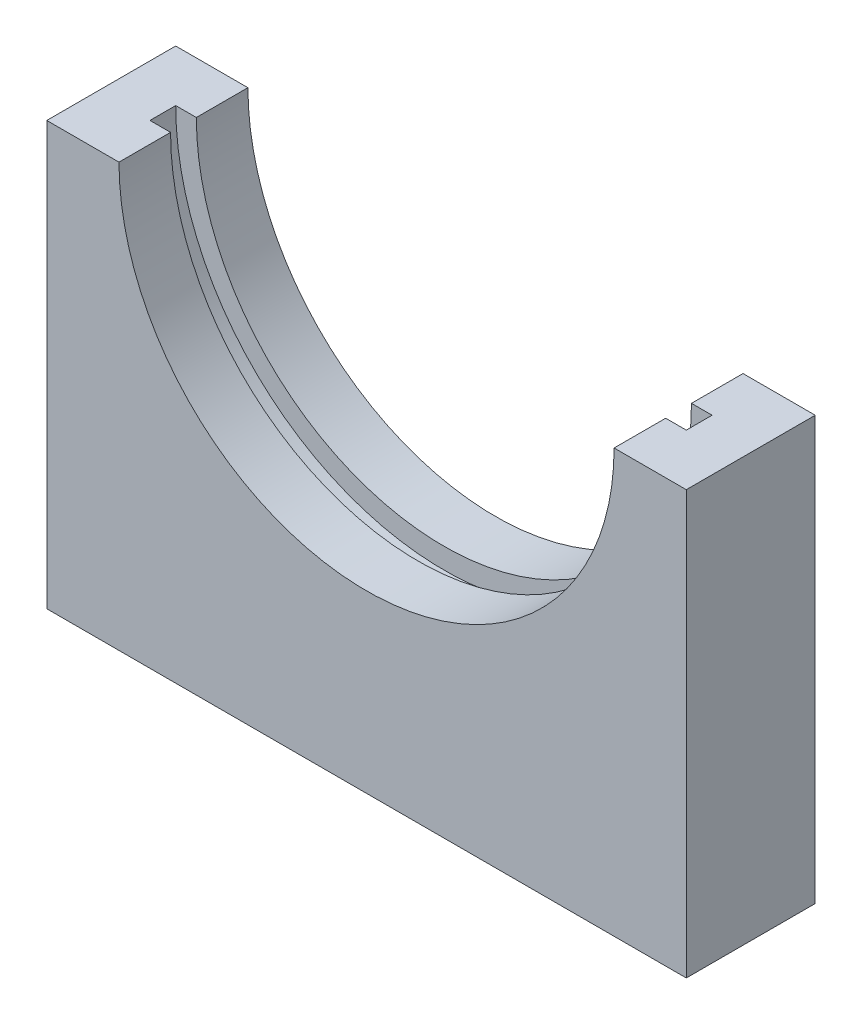
ISO-10303-21;
HEADER;
FILE_DESCRIPTION(('STEP AP214'),'2;1');
FILE_NAME('part.step','',(''),(''),'','','');
FILE_SCHEMA(('AUTOMOTIVE_DESIGN { 1 0 10303 214 1 1 1 1 }'));
ENDSEC;
DATA;
#1=APPLICATION_CONTEXT('core data for automotive mechanical design processes');
#2=APPLICATION_PROTOCOL_DEFINITION('international standard','automotive_design',2000,#1);
#3=PRODUCT_CONTEXT('',#1,'mechanical');
#4=PRODUCT('Part','Part','',(#3));
#5=PRODUCT_RELATED_PRODUCT_CATEGORY('part','',(#4));
#6=PRODUCT_DEFINITION_FORMATION('','',#4);
#7=PRODUCT_DEFINITION_CONTEXT('part definition',#1,'design');
#8=PRODUCT_DEFINITION('design','',#6,#7);
#9=PRODUCT_DEFINITION_SHAPE('','',#8);
#10=(LENGTH_UNIT() NAMED_UNIT(*) SI_UNIT(.MILLI.,.METRE.));
#11=(NAMED_UNIT(*) PLANE_ANGLE_UNIT() SI_UNIT($,.RADIAN.));
#12=(NAMED_UNIT(*) SI_UNIT($,.STERADIAN.) SOLID_ANGLE_UNIT());
#13=UNCERTAINTY_MEASURE_WITH_UNIT(LENGTH_MEASURE(1.E-05),#10,'distance_accuracy_value','');
#14=(GEOMETRIC_REPRESENTATION_CONTEXT(3) GLOBAL_UNCERTAINTY_ASSIGNED_CONTEXT((#13)) GLOBAL_UNIT_ASSIGNED_CONTEXT((#10,
#11,#12)) REPRESENTATION_CONTEXT('',''));
#15=CARTESIAN_POINT('',(0.,0.,0.));
#16=DIRECTION('',(0.,0.,1.));
#17=DIRECTION('',(1.,0.,0.));
#18=AXIS2_PLACEMENT_3D('',#15,#16,#17);
#19=CARTESIAN_POINT('',(0.,0.,2.5));
#20=DIRECTION('',(0.,0.,-1.));
#21=DIRECTION('',(-1.,0.,0.));
#22=AXIS2_PLACEMENT_3D('',#19,#20,#21);
#23=CYLINDRICAL_SURFACE('',#22,26.);
#24=CARTESIAN_POINT('',(0.,0.,0.));
#25=DIRECTION('',(0.,0.,1.));
#26=DIRECTION('',(1.,0.,0.));
#27=AXIS2_PLACEMENT_3D('',#24,#25,#26);
#28=CIRCLE('',#27,26.);
#29=CARTESIAN_POINT('',(-26.,0.,0.));
#30=VERTEX_POINT('',#29);
#31=CARTESIAN_POINT('',(26.,0.,0.));
#32=VERTEX_POINT('',#31);
#33=EDGE_CURVE('E38',#30,#32,#28,.T.);
#34=ORIENTED_EDGE('',*,*,#33,.F.);
#35=DIRECTION('',(0.,0.,-1.));
#36=VECTOR('',#35,1.);
#37=CARTESIAN_POINT('',(-26.,0.,2.5));
#38=LINE('',#37,#36);
#39=CARTESIAN_POINT('',(-26.,0.,2.5));
#40=VERTEX_POINT('',#39);
#41=EDGE_CURVE('E11',#40,#30,#38,.T.);
#42=ORIENTED_EDGE('',*,*,#41,.F.);
#43=CARTESIAN_POINT('',(0.,0.,2.5));
#44=DIRECTION('',(0.,0.,1.));
#45=DIRECTION('',(1.,0.,0.));
#46=AXIS2_PLACEMENT_3D('',#43,#44,#45);
#47=CIRCLE('',#46,26.);
#48=CARTESIAN_POINT('',(26.,0.,2.5));
#49=VERTEX_POINT('',#48);
#50=EDGE_CURVE('E201',#40,#49,#47,.T.);
#51=ORIENTED_EDGE('',*,*,#50,.T.);
#52=DIRECTION('',(0.,0.,-1.));
#53=VECTOR('',#52,1.);
#54=CARTESIAN_POINT('',(26.,0.,2.5));
#55=LINE('',#54,#53);
#56=EDGE_CURVE('E199',#49,#32,#55,.T.);
#57=ORIENTED_EDGE('',*,*,#56,.T.);
#58=EDGE_LOOP('',(#34,#42,#51,#57));
#59=FACE_BOUND('',#58,.T.);
#60=ADVANCED_FACE('F35',(#59),#23,.F.);
#61=CARTESIAN_POINT('',(0.,0.,2.5));
#62=DIRECTION('',(0.,-1.,0.));
#63=DIRECTION('',(1.,0.,0.));
#64=AXIS2_PLACEMENT_3D('',#61,#62,#63);
#65=PLANE('',#64);
#66=ORIENTED_EDGE('',*,*,#41,.T.);
#67=DIRECTION('',(1.,0.,0.));
#68=VECTOR('',#67,1.);
#69=CARTESIAN_POINT('',(-24.,0.,0.));
#70=LINE('',#69,#68);
#71=CARTESIAN_POINT('',(-24.,0.,0.));
#72=VERTEX_POINT('',#71);
#73=EDGE_CURVE('E132',#30,#72,#70,.T.);
#74=ORIENTED_EDGE('',*,*,#73,.T.);
#75=DIRECTION('',(0.,0.,1.));
#76=VECTOR('',#75,1.);
#77=CARTESIAN_POINT('',(-24.,0.,-5.));
#78=LINE('',#77,#76);
#79=CARTESIAN_POINT('',(-24.,0.,-5.));
#80=VERTEX_POINT('',#79);
#81=EDGE_CURVE('E138',#80,#72,#78,.T.);
#82=ORIENTED_EDGE('',*,*,#81,.F.);
#83=DIRECTION('',(1.,0.,0.));
#84=VECTOR('',#83,1.);
#85=CARTESIAN_POINT('',(-24.,0.,-5.));
#86=LINE('',#85,#84);
#87=CARTESIAN_POINT('',(-31.,0.,-5.));
#88=VERTEX_POINT('',#87);
#89=EDGE_CURVE('E128',#88,#80,#86,.T.);
#90=ORIENTED_EDGE('',*,*,#89,.F.);
#91=DIRECTION('',(0.,0.,-1.));
#92=VECTOR('',#91,1.);
#93=CARTESIAN_POINT('',(-31.,0.,2.5));
#94=LINE('',#93,#92);
#95=CARTESIAN_POINT('',(-31.,0.,7.5));
#96=VERTEX_POINT('',#95);
#97=EDGE_CURVE('E45',#96,#88,#94,.T.);
#98=ORIENTED_EDGE('',*,*,#97,.F.);
#99=DIRECTION('',(-1.,0.,0.));
#100=VECTOR('',#99,1.);
#101=CARTESIAN_POINT('',(-24.,0.,7.5));
#102=LINE('',#101,#100);
#103=CARTESIAN_POINT('',(-24.,0.,7.5));
#104=VERTEX_POINT('',#103);
#105=EDGE_CURVE('E222',#104,#96,#102,.T.);
#106=ORIENTED_EDGE('',*,*,#105,.F.);
#107=DIRECTION('',(0.,0.,-1.));
#108=VECTOR('',#107,1.);
#109=CARTESIAN_POINT('',(-24.,0.,7.5));
#110=LINE('',#109,#108);
#111=CARTESIAN_POINT('',(-24.,0.,2.5));
#112=VERTEX_POINT('',#111);
#113=EDGE_CURVE('E233',#104,#112,#110,.T.);
#114=ORIENTED_EDGE('',*,*,#113,.T.);
#115=DIRECTION('',(-1.,0.,0.));
#116=VECTOR('',#115,1.);
#117=CARTESIAN_POINT('',(-24.,0.,2.5));
#118=LINE('',#117,#116);
#119=EDGE_CURVE('E141',#112,#40,#118,.T.);
#120=ORIENTED_EDGE('',*,*,#119,.T.);
#121=EDGE_LOOP('',(#66,#74,#82,#90,#98,#106,#114,#120));
#122=FACE_BOUND('',#121,.T.);
#123=ADVANCED_FACE('F245',(#122),#65,.F.);
#124=CARTESIAN_POINT('',(-31.,0.,2.5));
#125=DIRECTION('',(1.,0.,0.));
#126=DIRECTION('',(0.,1.,0.));
#127=AXIS2_PLACEMENT_3D('',#124,#125,#126);
#128=PLANE('',#127);
#129=ORIENTED_EDGE('',*,*,#97,.T.);
#130=DIRECTION('',(0.,1.,0.));
#131=VECTOR('',#130,1.);
#132=CARTESIAN_POINT('',(-31.,-41.,-5.));
#133=LINE('',#132,#131);
#134=CARTESIAN_POINT('',(-31.,-41.,-5.));
#135=VERTEX_POINT('',#134);
#136=EDGE_CURVE('E156',#135,#88,#133,.T.);
#137=ORIENTED_EDGE('',*,*,#136,.F.);
#138=DIRECTION('',(0.,0.,-1.));
#139=VECTOR('',#138,1.);
#140=CARTESIAN_POINT('',(-31.,-41.,2.5));
#141=LINE('',#140,#139);
#142=CARTESIAN_POINT('',(-31.,-41.,7.5));
#143=VERTEX_POINT('',#142);
#144=EDGE_CURVE('E184',#143,#135,#141,.T.);
#145=ORIENTED_EDGE('',*,*,#144,.F.);
#146=DIRECTION('',(0.,-1.,0.));
#147=VECTOR('',#146,1.);
#148=CARTESIAN_POINT('',(-31.,0.,7.5));
#149=LINE('',#148,#147);
#150=EDGE_CURVE('E193',#96,#143,#149,.T.);
#151=ORIENTED_EDGE('',*,*,#150,.F.);
#152=EDGE_LOOP('',(#129,#137,#145,#151));
#153=FACE_BOUND('',#152,.T.);
#154=ADVANCED_FACE('F180',(#153),#128,.F.);
#155=CARTESIAN_POINT('',(0.,-41.,2.5));
#156=DIRECTION('',(0.,1.,0.));
#157=DIRECTION('',(0.,0.,1.));
#158=AXIS2_PLACEMENT_3D('',#155,#156,#157);
#159=PLANE('',#158);
#160=CARTESIAN_POINT('',(0.,-41.,1.25));
#161=DIRECTION('',(0.,-1.,0.));
#162=DIRECTION('',(0.,0.,-1.));
#163=AXIS2_PLACEMENT_3D('',#160,#161,#162);
#164=CIRCLE('',#163,2.75);
#165=CARTESIAN_POINT('',(0.,-41.,-1.5));
#166=VERTEX_POINT('',#165);
#167=EDGE_CURVE('E162',#166,#166,#164,.T.);
#168=ORIENTED_EDGE('',*,*,#167,.F.);
#169=EDGE_LOOP('',(#168));
#170=FACE_BOUND('',#169,.T.);
#171=ORIENTED_EDGE('',*,*,#144,.T.);
#172=DIRECTION('',(-1.,0.,0.));
#173=VECTOR('',#172,1.);
#174=CARTESIAN_POINT('',(31.,-41.,-5.));
#175=LINE('',#174,#173);
#176=CARTESIAN_POINT('',(31.,-41.,-5.));
#177=VERTEX_POINT('',#176);
#178=EDGE_CURVE('E158',#177,#135,#175,.T.);
#179=ORIENTED_EDGE('',*,*,#178,.F.);
#180=DIRECTION('',(0.,0.,-1.));
#181=VECTOR('',#180,1.);
#182=CARTESIAN_POINT('',(31.,-41.,2.5));
#183=LINE('',#182,#181);
#184=CARTESIAN_POINT('',(31.,-41.,7.5));
#185=VERTEX_POINT('',#184);
#186=EDGE_CURVE('E191',#185,#177,#183,.T.);
#187=ORIENTED_EDGE('',*,*,#186,.F.);
#188=DIRECTION('',(1.,0.,0.));
#189=VECTOR('',#188,1.);
#190=CARTESIAN_POINT('',(-31.,-41.,7.5));
#191=LINE('',#190,#189);
#192=EDGE_CURVE('E186',#143,#185,#191,.T.);
#193=ORIENTED_EDGE('',*,*,#192,.F.);
#194=EDGE_LOOP('',(#171,#179,#187,#193));
#195=FACE_BOUND('',#194,.T.);
#196=ADVANCED_FACE('F176',(#170,#195),#159,.F.);
#197=CARTESIAN_POINT('',(31.,0.,2.5));
#198=DIRECTION('',(1.,0.,0.));
#199=DIRECTION('',(0.,1.,0.));
#200=AXIS2_PLACEMENT_3D('',#197,#198,#199);
#201=PLANE('',#200);
#202=ORIENTED_EDGE('',*,*,#186,.T.);
#203=DIRECTION('',(0.,-1.,0.));
#204=VECTOR('',#203,1.);
#205=CARTESIAN_POINT('',(31.,0.,-5.));
#206=LINE('',#205,#204);
#207=CARTESIAN_POINT('',(31.,0.,-5.));
#208=VERTEX_POINT('',#207);
#209=EDGE_CURVE('E121',#208,#177,#206,.T.);
#210=ORIENTED_EDGE('',*,*,#209,.F.);
#211=DIRECTION('',(0.,0.,-1.));
#212=VECTOR('',#211,1.);
#213=CARTESIAN_POINT('',(31.,0.,2.5));
#214=LINE('',#213,#212);
#215=CARTESIAN_POINT('',(31.,0.,7.5));
#216=VERTEX_POINT('',#215);
#217=EDGE_CURVE('E117',#216,#208,#214,.T.);
#218=ORIENTED_EDGE('',*,*,#217,.F.);
#219=DIRECTION('',(0.,1.,0.));
#220=VECTOR('',#219,1.);
#221=CARTESIAN_POINT('',(31.,-41.,7.5));
#222=LINE('',#221,#220);
#223=EDGE_CURVE('E215',#185,#216,#222,.T.);
#224=ORIENTED_EDGE('',*,*,#223,.F.);
#225=EDGE_LOOP('',(#202,#210,#218,#224));
#226=FACE_BOUND('',#225,.T.);
#227=ADVANCED_FACE('F179',(#226),#201,.T.);
#228=CARTESIAN_POINT('',(0.,0.,2.5));
#229=DIRECTION('',(0.,1.,0.));
#230=DIRECTION('',(0.,0.,1.));
#231=AXIS2_PLACEMENT_3D('',#228,#229,#230);
#232=PLANE('',#231);
#233=ORIENTED_EDGE('',*,*,#217,.T.);
#234=DIRECTION('',(1.,0.,0.));
#235=VECTOR('',#234,1.);
#236=CARTESIAN_POINT('',(24.,0.,-5.));
#237=LINE('',#236,#235);
#238=CARTESIAN_POINT('',(24.,0.,-5.));
#239=VERTEX_POINT('',#238);
#240=EDGE_CURVE('E109',#239,#208,#237,.T.);
#241=ORIENTED_EDGE('',*,*,#240,.F.);
#242=DIRECTION('',(0.,0.,1.));
#243=VECTOR('',#242,1.);
#244=CARTESIAN_POINT('',(24.,0.,-5.));
#245=LINE('',#244,#243);
#246=CARTESIAN_POINT('',(24.,0.,0.));
#247=VERTEX_POINT('',#246);
#248=EDGE_CURVE('E114',#239,#247,#245,.T.);
#249=ORIENTED_EDGE('',*,*,#248,.T.);
#250=DIRECTION('',(1.,0.,0.));
#251=VECTOR('',#250,1.);
#252=CARTESIAN_POINT('',(24.,0.,0.));
#253=LINE('',#252,#251);
#254=EDGE_CURVE('E147',#247,#32,#253,.T.);
#255=ORIENTED_EDGE('',*,*,#254,.T.);
#256=ORIENTED_EDGE('',*,*,#56,.F.);
#257=DIRECTION('',(-1.,0.,0.));
#258=VECTOR('',#257,1.);
#259=CARTESIAN_POINT('',(31.,0.,2.5));
#260=LINE('',#259,#258);
#261=CARTESIAN_POINT('',(24.,0.,2.5));
#262=VERTEX_POINT('',#261);
#263=EDGE_CURVE('E52',#49,#262,#260,.T.);
#264=ORIENTED_EDGE('',*,*,#263,.T.);
#265=DIRECTION('',(0.,0.,-1.));
#266=VECTOR('',#265,1.);
#267=CARTESIAN_POINT('',(24.,0.,7.5));
#268=LINE('',#267,#266);
#269=CARTESIAN_POINT('',(24.,0.,7.5));
#270=VERTEX_POINT('',#269);
#271=EDGE_CURVE('E226',#270,#262,#268,.T.);
#272=ORIENTED_EDGE('',*,*,#271,.F.);
#273=DIRECTION('',(-1.,0.,0.));
#274=VECTOR('',#273,1.);
#275=CARTESIAN_POINT('',(31.,0.,7.5));
#276=LINE('',#275,#274);
#277=EDGE_CURVE('E220',#216,#270,#276,.T.);
#278=ORIENTED_EDGE('',*,*,#277,.F.);
#279=EDGE_LOOP('',(#233,#241,#249,#255,#256,#264,#272,#278));
#280=FACE_BOUND('',#279,.T.);
#281=ADVANCED_FACE('F111',(#280),#232,.T.);
#282=CARTESIAN_POINT('',(0.,0.,7.5));
#283=DIRECTION('',(0.,0.,-1.));
#284=DIRECTION('',(-1.,0.,0.));
#285=AXIS2_PLACEMENT_3D('',#282,#283,#284);
#286=CYLINDRICAL_SURFACE('',#285,24.);
#287=CARTESIAN_POINT('',(0.,0.,2.5));
#288=DIRECTION('',(0.,0.,-1.));
#289=DIRECTION('',(1.,0.,0.));
#290=AXIS2_PLACEMENT_3D('',#287,#288,#289);
#291=CIRCLE('',#290,24.);
#292=EDGE_CURVE('E137',#262,#112,#291,.T.);
#293=ORIENTED_EDGE('',*,*,#292,.T.);
#294=ORIENTED_EDGE('',*,*,#113,.F.);
#295=CARTESIAN_POINT('',(0.,0.,7.5));
#296=DIRECTION('',(0.,0.,-1.));
#297=DIRECTION('',(1.,0.,0.));
#298=AXIS2_PLACEMENT_3D('',#295,#296,#297);
#299=CIRCLE('',#298,24.);
#300=EDGE_CURVE('E232',#270,#104,#299,.T.);
#301=ORIENTED_EDGE('',*,*,#300,.F.);
#302=ORIENTED_EDGE('',*,*,#271,.T.);
#303=EDGE_LOOP('',(#293,#294,#301,#302));
#304=FACE_BOUND('',#303,.T.);
#305=ADVANCED_FACE('F242',(#304),#286,.F.);
#306=CARTESIAN_POINT('',(0.,0.,7.5));
#307=DIRECTION('',(0.,0.,1.));
#308=DIRECTION('',(1.,0.,0.));
#309=AXIS2_PLACEMENT_3D('',#306,#307,#308);
#310=PLANE('',#309);
#311=ORIENTED_EDGE('',*,*,#300,.T.);
#312=ORIENTED_EDGE('',*,*,#105,.T.);
#313=ORIENTED_EDGE('',*,*,#150,.T.);
#314=ORIENTED_EDGE('',*,*,#192,.T.);
#315=ORIENTED_EDGE('',*,*,#223,.T.);
#316=ORIENTED_EDGE('',*,*,#277,.T.);
#317=EDGE_LOOP('',(#311,#312,#313,#314,#315,#316));
#318=FACE_BOUND('',#317,.T.);
#319=ADVANCED_FACE('F218',(#318),#310,.T.);
#320=CARTESIAN_POINT('',(0.,0.,2.5));
#321=DIRECTION('',(0.,0.,1.));
#322=DIRECTION('',(1.,0.,0.));
#323=AXIS2_PLACEMENT_3D('',#320,#321,#322);
#324=PLANE('',#323);
#325=ORIENTED_EDGE('',*,*,#50,.F.);
#326=ORIENTED_EDGE('',*,*,#119,.F.);
#327=ORIENTED_EDGE('',*,*,#292,.F.);
#328=ORIENTED_EDGE('',*,*,#263,.F.);
#329=EDGE_LOOP('',(#325,#326,#327,#328));
#330=FACE_BOUND('',#329,.T.);
#331=ADVANCED_FACE('F243',(#330),#324,.F.);
#332=CARTESIAN_POINT('',(0.,0.,0.));
#333=DIRECTION('',(0.,0.,-1.));
#334=DIRECTION('',(-1.,0.,0.));
#335=AXIS2_PLACEMENT_3D('',#332,#333,#334);
#336=PLANE('',#335);
#337=ORIENTED_EDGE('',*,*,#73,.F.);
#338=ORIENTED_EDGE('',*,*,#33,.T.);
#339=ORIENTED_EDGE('',*,*,#254,.F.);
#340=CARTESIAN_POINT('',(0.,0.,0.));
#341=DIRECTION('',(0.,0.,1.));
#342=DIRECTION('',(-1.,0.,0.));
#343=AXIS2_PLACEMENT_3D('',#340,#341,#342);
#344=CIRCLE('',#343,24.);
#345=EDGE_CURVE('E136',#72,#247,#344,.T.);
#346=ORIENTED_EDGE('',*,*,#345,.F.);
#347=EDGE_LOOP('',(#337,#338,#339,#346));
#348=FACE_BOUND('',#347,.T.);
#349=ADVANCED_FACE('F250',(#348),#336,.F.);
#350=CARTESIAN_POINT('',(0.,0.,-5.));
#351=DIRECTION('',(0.,0.,1.));
#352=DIRECTION('',(1.,0.,0.));
#353=AXIS2_PLACEMENT_3D('',#350,#351,#352);
#354=CYLINDRICAL_SURFACE('',#353,24.);
#355=ORIENTED_EDGE('',*,*,#345,.T.);
#356=ORIENTED_EDGE('',*,*,#248,.F.);
#357=CARTESIAN_POINT('',(0.,0.,-5.));
#358=DIRECTION('',(0.,0.,1.));
#359=DIRECTION('',(-1.,0.,0.));
#360=AXIS2_PLACEMENT_3D('',#357,#358,#359);
#361=CIRCLE('',#360,24.);
#362=EDGE_CURVE('E122',#80,#239,#361,.T.);
#363=ORIENTED_EDGE('',*,*,#362,.F.);
#364=ORIENTED_EDGE('',*,*,#81,.T.);
#365=EDGE_LOOP('',(#355,#356,#363,#364));
#366=FACE_BOUND('',#365,.T.);
#367=ADVANCED_FACE('F134',(#366),#354,.F.);
#368=CARTESIAN_POINT('',(0.,0.,-5.));
#369=DIRECTION('',(0.,0.,-1.));
#370=DIRECTION('',(-1.,0.,0.));
#371=AXIS2_PLACEMENT_3D('',#368,#369,#370);
#372=PLANE('',#371);
#373=ORIENTED_EDGE('',*,*,#362,.T.);
#374=ORIENTED_EDGE('',*,*,#240,.T.);
#375=ORIENTED_EDGE('',*,*,#209,.T.);
#376=ORIENTED_EDGE('',*,*,#178,.T.);
#377=ORIENTED_EDGE('',*,*,#136,.T.);
#378=ORIENTED_EDGE('',*,*,#89,.T.);
#379=EDGE_LOOP('',(#373,#374,#375,#376,#377,#378));
#380=FACE_BOUND('',#379,.T.);
#381=ADVANCED_FACE('F125',(#380),#372,.T.);
#382=CARTESIAN_POINT('',(0.,-31.,1.25));
#383=DIRECTION('',(0.,-1.,0.));
#384=DIRECTION('',(0.,0.,-1.));
#385=AXIS2_PLACEMENT_3D('',#382,#383,#384);
#386=CYLINDRICAL_SURFACE('',#385,2.75);
#387=CARTESIAN_POINT('',(0.,-31.,1.25));
#388=DIRECTION('',(0.,-1.,0.));
#389=DIRECTION('',(0.,0.,-1.));
#390=AXIS2_PLACEMENT_3D('',#387,#388,#389);
#391=CIRCLE('',#390,2.75);
#392=CARTESIAN_POINT('',(0.,-31.,-1.5));
#393=VERTEX_POINT('',#392);
#394=EDGE_CURVE('E154',#393,#393,#391,.T.);
#395=ORIENTED_EDGE('',*,*,#394,.F.);
#396=EDGE_LOOP('',(#395));
#397=FACE_BOUND('',#396,.T.);
#398=ORIENTED_EDGE('',*,*,#167,.T.);
#399=EDGE_LOOP('',(#398));
#400=FACE_BOUND('',#399,.T.);
#401=ADVANCED_FACE('F170',(#397,#400),#386,.F.);
#402=CARTESIAN_POINT('',(0.,-31.,1.25));
#403=DIRECTION('',(0.,-1.,0.));
#404=DIRECTION('',(0.,0.,-1.));
#405=AXIS2_PLACEMENT_3D('',#402,#403,#404);
#406=PLANE('',#405);
#407=ORIENTED_EDGE('',*,*,#394,.T.);
#408=EDGE_LOOP('',(#407));
#409=FACE_BOUND('',#408,.T.);
#410=ADVANCED_FACE('F168',(#409),#406,.T.);
#411=CLOSED_SHELL('',(#60,#123,#154,#196,#227,#281,#305,#319,#331,#349,#367,#381,#401,#410));
#412=MANIFOLD_SOLID_BREP('B2',#411);
#413=ADVANCED_BREP_SHAPE_REPRESENTATION('',(#18,#412),#14);
#414=SHAPE_DEFINITION_REPRESENTATION(#9,#413);
ENDSEC;
END-ISO-10303-21;
